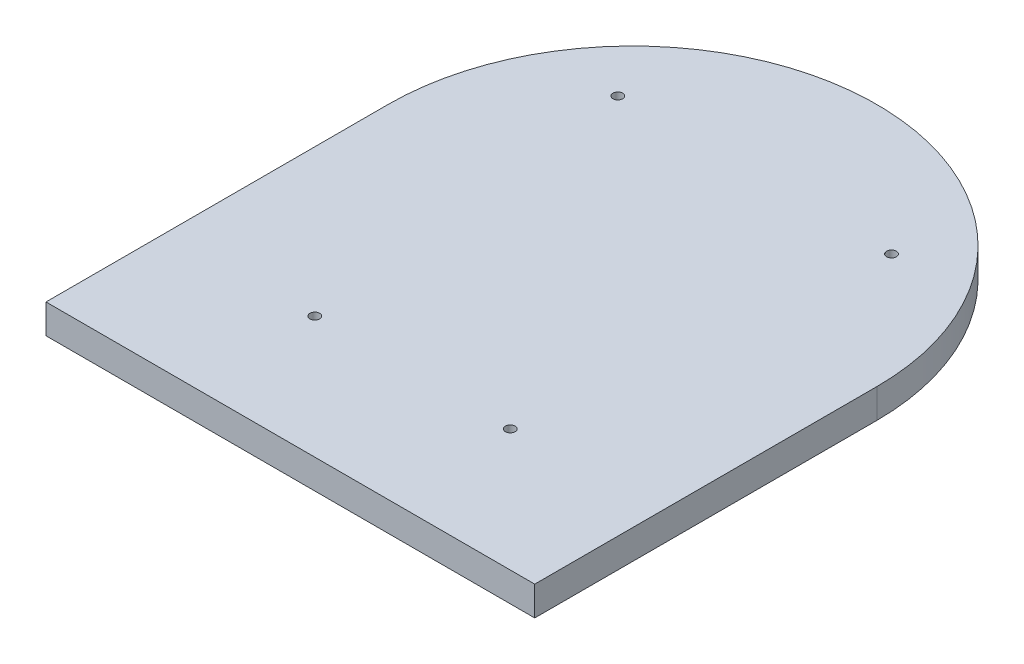
ISO-10303-21;
HEADER;
FILE_DESCRIPTION(('STEP AP214'),'2;1');
FILE_NAME('part.step','',(''),(''),'','','');
FILE_SCHEMA(('AUTOMOTIVE_DESIGN { 1 0 10303 214 1 1 1 1 }'));
ENDSEC;
DATA;
#1=APPLICATION_CONTEXT('core data for automotive mechanical design processes');
#2=APPLICATION_PROTOCOL_DEFINITION('international standard','automotive_design',2000,#1);
#3=PRODUCT_CONTEXT('',#1,'mechanical');
#4=PRODUCT('Part','Part','',(#3));
#5=PRODUCT_RELATED_PRODUCT_CATEGORY('part','',(#4));
#6=PRODUCT_DEFINITION_FORMATION('','',#4);
#7=PRODUCT_DEFINITION_CONTEXT('part definition',#1,'design');
#8=PRODUCT_DEFINITION('design','',#6,#7);
#9=PRODUCT_DEFINITION_SHAPE('','',#8);
#10=(LENGTH_UNIT() NAMED_UNIT(*) SI_UNIT(.MILLI.,.METRE.));
#11=(NAMED_UNIT(*) PLANE_ANGLE_UNIT() SI_UNIT($,.RADIAN.));
#12=(NAMED_UNIT(*) SI_UNIT($,.STERADIAN.) SOLID_ANGLE_UNIT());
#13=UNCERTAINTY_MEASURE_WITH_UNIT(LENGTH_MEASURE(1.E-05),#10,'distance_accuracy_value','');
#14=(GEOMETRIC_REPRESENTATION_CONTEXT(3) GLOBAL_UNCERTAINTY_ASSIGNED_CONTEXT((#13)) GLOBAL_UNIT_ASSIGNED_CONTEXT((#10,
#11,#12)) REPRESENTATION_CONTEXT('',''));
#15=CARTESIAN_POINT('',(0.,0.,0.));
#16=DIRECTION('',(0.,0.,1.));
#17=DIRECTION('',(1.,0.,0.));
#18=AXIS2_PLACEMENT_3D('',#15,#16,#17);
#19=CARTESIAN_POINT('',(50.,6.,-70.));
#20=DIRECTION('',(0.,-1.,0.));
#21=DIRECTION('',(0.,0.,-1.));
#22=AXIS2_PLACEMENT_3D('',#19,#20,#21);
#23=PLANE('',#22);
#24=DIRECTION('',(0.,0.,1.));
#25=VECTOR('',#24,1.);
#26=CARTESIAN_POINT('',(0.,6.,0.));
#27=LINE('',#26,#25);
#28=CARTESIAN_POINT('',(0.,6.,-70.));
#29=VERTEX_POINT('',#28);
#30=CARTESIAN_POINT('',(0.,6.,0.));
#31=VERTEX_POINT('',#30);
#32=EDGE_CURVE('E92',#29,#31,#27,.T.);
#33=ORIENTED_EDGE('',*,*,#32,.T.);
#34=DIRECTION('',(1.,0.,0.));
#35=VECTOR('',#34,1.);
#36=CARTESIAN_POINT('',(0.,6.,0.));
#37=LINE('',#36,#35);
#38=CARTESIAN_POINT('',(100.,6.,0.));
#39=VERTEX_POINT('',#38);
#40=EDGE_CURVE('E87',#31,#39,#37,.T.);
#41=ORIENTED_EDGE('',*,*,#40,.T.);
#42=DIRECTION('',(0.,0.,-1.));
#43=VECTOR('',#42,1.);
#44=CARTESIAN_POINT('',(100.,6.,0.));
#45=LINE('',#44,#43);
#46=CARTESIAN_POINT('',(100.,6.,-70.));
#47=VERTEX_POINT('',#46);
#48=EDGE_CURVE('E90',#39,#47,#45,.T.);
#49=ORIENTED_EDGE('',*,*,#48,.T.);
#50=CARTESIAN_POINT('',(50.,6.,-70.));
#51=DIRECTION('',(0.,1.,0.));
#52=DIRECTION('',(0.,0.,-1.));
#53=AXIS2_PLACEMENT_3D('',#50,#51,#52);
#54=CIRCLE('',#53,50.);
#55=EDGE_CURVE('E57',#47,#29,#54,.T.);
#56=ORIENTED_EDGE('',*,*,#55,.T.);
#57=EDGE_LOOP('',(#33,#41,#49,#56));
#58=FACE_BOUND('',#57,.T.);
#59=CARTESIAN_POINT('',(22.,6.,-95.));
#60=DIRECTION('',(0.,1.,0.));
#61=DIRECTION('',(0.,0.,1.));
#62=AXIS2_PLACEMENT_3D('',#59,#60,#61);
#63=CIRCLE('',#62,1.);
#64=CARTESIAN_POINT('',(22.,6.,-94.));
#65=VERTEX_POINT('',#64);
#66=EDGE_CURVE('E112',#65,#65,#63,.T.);
#67=ORIENTED_EDGE('',*,*,#66,.F.);
#68=EDGE_LOOP('',(#67));
#69=FACE_BOUND('',#68,.T.);
#70=CARTESIAN_POINT('',(78.,6.,-95.));
#71=DIRECTION('',(0.,1.,0.));
#72=DIRECTION('',(0.,0.,1.));
#73=AXIS2_PLACEMENT_3D('',#70,#71,#72);
#74=CIRCLE('',#73,0.999999999999998);
#75=CARTESIAN_POINT('',(78.,6.,-94.));
#76=VERTEX_POINT('',#75);
#77=EDGE_CURVE('E134',#76,#76,#74,.T.);
#78=ORIENTED_EDGE('',*,*,#77,.F.);
#79=EDGE_LOOP('',(#78));
#80=FACE_BOUND('',#79,.T.);
#81=CARTESIAN_POINT('',(30.,6.,-25.));
#82=DIRECTION('',(0.,1.,0.));
#83=DIRECTION('',(0.,0.,1.));
#84=AXIS2_PLACEMENT_3D('',#81,#82,#83);
#85=CIRCLE('',#84,1.);
#86=CARTESIAN_POINT('',(30.,6.,-24.));
#87=VERTEX_POINT('',#86);
#88=EDGE_CURVE('E142',#87,#87,#85,.T.);
#89=ORIENTED_EDGE('',*,*,#88,.F.);
#90=EDGE_LOOP('',(#89));
#91=FACE_BOUND('',#90,.T.);
#92=CARTESIAN_POINT('',(70.,6.,-25.));
#93=DIRECTION('',(0.,1.,0.));
#94=DIRECTION('',(0.,0.,1.));
#95=AXIS2_PLACEMENT_3D('',#92,#93,#94);
#96=CIRCLE('',#95,0.999999999999998);
#97=CARTESIAN_POINT('',(70.,6.,-24.));
#98=VERTEX_POINT('',#97);
#99=EDGE_CURVE('E150',#98,#98,#96,.T.);
#100=ORIENTED_EDGE('',*,*,#99,.F.);
#101=EDGE_LOOP('',(#100));
#102=FACE_BOUND('',#101,.T.);
#103=ADVANCED_FACE('F39',(#58,#69,#80,#91,#102),#23,.F.);
#104=CARTESIAN_POINT('',(50.,0.,-70.));
#105=DIRECTION('',(0.,-1.,0.));
#106=DIRECTION('',(0.,0.,-1.));
#107=AXIS2_PLACEMENT_3D('',#104,#105,#106);
#108=PLANE('',#107);
#109=CARTESIAN_POINT('',(30.,0.,-25.));
#110=DIRECTION('',(0.,1.,0.));
#111=DIRECTION('',(0.,0.,1.));
#112=AXIS2_PLACEMENT_3D('',#109,#110,#111);
#113=CIRCLE('',#112,1.);
#114=CARTESIAN_POINT('',(30.,0.,-24.));
#115=VERTEX_POINT('',#114);
#116=EDGE_CURVE('E146',#115,#115,#113,.T.);
#117=ORIENTED_EDGE('',*,*,#116,.T.);
#118=EDGE_LOOP('',(#117));
#119=FACE_BOUND('',#118,.T.);
#120=CARTESIAN_POINT('',(22.,0.,-95.));
#121=DIRECTION('',(0.,1.,0.));
#122=DIRECTION('',(0.,0.,1.));
#123=AXIS2_PLACEMENT_3D('',#120,#121,#122);
#124=CIRCLE('',#123,1.);
#125=CARTESIAN_POINT('',(22.,0.,-94.));
#126=VERTEX_POINT('',#125);
#127=EDGE_CURVE('E130',#126,#126,#124,.T.);
#128=ORIENTED_EDGE('',*,*,#127,.T.);
#129=EDGE_LOOP('',(#128));
#130=FACE_BOUND('',#129,.T.);
#131=DIRECTION('',(0.,0.,1.));
#132=VECTOR('',#131,1.);
#133=CARTESIAN_POINT('',(0.,0.,0.));
#134=LINE('',#133,#132);
#135=CARTESIAN_POINT('',(0.,0.,-70.));
#136=VERTEX_POINT('',#135);
#137=CARTESIAN_POINT('',(0.,0.,0.));
#138=VERTEX_POINT('',#137);
#139=EDGE_CURVE('E108',#136,#138,#134,.T.);
#140=ORIENTED_EDGE('',*,*,#139,.F.);
#141=CARTESIAN_POINT('',(50.,0.,-70.));
#142=DIRECTION('',(0.,1.,0.));
#143=DIRECTION('',(0.,0.,-1.));
#144=AXIS2_PLACEMENT_3D('',#141,#142,#143);
#145=CIRCLE('',#144,50.);
#146=CARTESIAN_POINT('',(100.,0.,-70.));
#147=VERTEX_POINT('',#146);
#148=EDGE_CURVE('E80',#147,#136,#145,.T.);
#149=ORIENTED_EDGE('',*,*,#148,.F.);
#150=DIRECTION('',(0.,0.,-1.));
#151=VECTOR('',#150,1.);
#152=CARTESIAN_POINT('',(100.,0.,0.));
#153=LINE('',#152,#151);
#154=CARTESIAN_POINT('',(100.,0.,0.));
#155=VERTEX_POINT('',#154);
#156=EDGE_CURVE('E74',#155,#147,#153,.T.);
#157=ORIENTED_EDGE('',*,*,#156,.F.);
#158=DIRECTION('',(1.,0.,0.));
#159=VECTOR('',#158,1.);
#160=CARTESIAN_POINT('',(0.,0.,0.));
#161=LINE('',#160,#159);
#162=EDGE_CURVE('E97',#138,#155,#161,.T.);
#163=ORIENTED_EDGE('',*,*,#162,.F.);
#164=EDGE_LOOP('',(#140,#149,#157,#163));
#165=FACE_BOUND('',#164,.T.);
#166=CARTESIAN_POINT('',(78.,0.,-95.));
#167=DIRECTION('',(0.,1.,0.));
#168=DIRECTION('',(0.,0.,1.));
#169=AXIS2_PLACEMENT_3D('',#166,#167,#168);
#170=CIRCLE('',#169,0.999999999999998);
#171=CARTESIAN_POINT('',(78.,0.,-94.));
#172=VERTEX_POINT('',#171);
#173=EDGE_CURVE('E138',#172,#172,#170,.T.);
#174=ORIENTED_EDGE('',*,*,#173,.T.);
#175=EDGE_LOOP('',(#174));
#176=FACE_BOUND('',#175,.T.);
#177=CARTESIAN_POINT('',(70.,0.,-25.));
#178=DIRECTION('',(0.,1.,0.));
#179=DIRECTION('',(0.,0.,1.));
#180=AXIS2_PLACEMENT_3D('',#177,#178,#179);
#181=CIRCLE('',#180,0.999999999999998);
#182=CARTESIAN_POINT('',(70.,0.,-24.));
#183=VERTEX_POINT('',#182);
#184=EDGE_CURVE('E154',#183,#183,#181,.T.);
#185=ORIENTED_EDGE('',*,*,#184,.T.);
#186=EDGE_LOOP('',(#185));
#187=FACE_BOUND('',#186,.T.);
#188=ADVANCED_FACE('F125',(#119,#130,#165,#176,#187),#108,.T.);
#189=CARTESIAN_POINT('',(0.,6.,0.));
#190=DIRECTION('',(1.,0.,0.));
#191=DIRECTION('',(0.,0.,-1.));
#192=AXIS2_PLACEMENT_3D('',#189,#190,#191);
#193=PLANE('',#192);
#194=ORIENTED_EDGE('',*,*,#139,.T.);
#195=DIRECTION('',(0.,-1.,0.));
#196=VECTOR('',#195,1.);
#197=CARTESIAN_POINT('',(0.,6.,0.));
#198=LINE('',#197,#196);
#199=EDGE_CURVE('E11',#31,#138,#198,.T.);
#200=ORIENTED_EDGE('',*,*,#199,.F.);
#201=ORIENTED_EDGE('',*,*,#32,.F.);
#202=DIRECTION('',(0.,-1.,0.));
#203=VECTOR('',#202,1.);
#204=CARTESIAN_POINT('',(0.,6.,-70.));
#205=LINE('',#204,#203);
#206=EDGE_CURVE('E104',#29,#136,#205,.T.);
#207=ORIENTED_EDGE('',*,*,#206,.T.);
#208=EDGE_LOOP('',(#194,#200,#201,#207));
#209=FACE_BOUND('',#208,.T.);
#210=ADVANCED_FACE('F41',(#209),#193,.F.);
#211=CARTESIAN_POINT('',(0.,6.,0.));
#212=DIRECTION('',(0.,0.,-1.));
#213=DIRECTION('',(-1.,0.,0.));
#214=AXIS2_PLACEMENT_3D('',#211,#212,#213);
#215=PLANE('',#214);
#216=ORIENTED_EDGE('',*,*,#162,.T.);
#217=DIRECTION('',(0.,-1.,0.));
#218=VECTOR('',#217,1.);
#219=CARTESIAN_POINT('',(100.,6.,0.));
#220=LINE('',#219,#218);
#221=EDGE_CURVE('E49',#39,#155,#220,.T.);
#222=ORIENTED_EDGE('',*,*,#221,.F.);
#223=ORIENTED_EDGE('',*,*,#40,.F.);
#224=ORIENTED_EDGE('',*,*,#199,.T.);
#225=EDGE_LOOP('',(#216,#222,#223,#224));
#226=FACE_BOUND('',#225,.T.);
#227=ADVANCED_FACE('F96',(#226),#215,.F.);
#228=CARTESIAN_POINT('',(100.,6.,0.));
#229=DIRECTION('',(-1.,0.,0.));
#230=DIRECTION('',(0.,0.,1.));
#231=AXIS2_PLACEMENT_3D('',#228,#229,#230);
#232=PLANE('',#231);
#233=ORIENTED_EDGE('',*,*,#156,.T.);
#234=DIRECTION('',(0.,-1.,0.));
#235=VECTOR('',#234,1.);
#236=CARTESIAN_POINT('',(100.,6.,-70.));
#237=LINE('',#236,#235);
#238=EDGE_CURVE('E99',#47,#147,#237,.T.);
#239=ORIENTED_EDGE('',*,*,#238,.F.);
#240=ORIENTED_EDGE('',*,*,#48,.F.);
#241=ORIENTED_EDGE('',*,*,#221,.T.);
#242=EDGE_LOOP('',(#233,#239,#240,#241));
#243=FACE_BOUND('',#242,.T.);
#244=ADVANCED_FACE('F100',(#243),#232,.F.);
#245=CARTESIAN_POINT('',(50.,6.,-70.));
#246=DIRECTION('',(0.,-1.,0.));
#247=DIRECTION('',(0.,0.,-1.));
#248=AXIS2_PLACEMENT_3D('',#245,#246,#247);
#249=CYLINDRICAL_SURFACE('',#248,50.);
#250=ORIENTED_EDGE('',*,*,#148,.T.);
#251=ORIENTED_EDGE('',*,*,#206,.F.);
#252=ORIENTED_EDGE('',*,*,#55,.F.);
#253=ORIENTED_EDGE('',*,*,#238,.T.);
#254=EDGE_LOOP('',(#250,#251,#252,#253));
#255=FACE_BOUND('',#254,.T.);
#256=ADVANCED_FACE('F122',(#255),#249,.T.);
#257=CARTESIAN_POINT('',(22.,6.,-95.));
#258=DIRECTION('',(0.,-1.,0.));
#259=DIRECTION('',(0.,0.,-1.));
#260=AXIS2_PLACEMENT_3D('',#257,#258,#259);
#261=CYLINDRICAL_SURFACE('',#260,1.);
#262=ORIENTED_EDGE('',*,*,#66,.T.);
#263=EDGE_LOOP('',(#262));
#264=FACE_BOUND('',#263,.T.);
#265=ORIENTED_EDGE('',*,*,#127,.F.);
#266=EDGE_LOOP('',(#265));
#267=FACE_BOUND('',#266,.T.);
#268=ADVANCED_FACE('F173',(#264,#267),#261,.F.);
#269=CARTESIAN_POINT('',(78.,6.,-95.));
#270=DIRECTION('',(0.,-1.,0.));
#271=DIRECTION('',(0.,0.,-1.));
#272=AXIS2_PLACEMENT_3D('',#269,#270,#271);
#273=CYLINDRICAL_SURFACE('',#272,0.999999999999998);
#274=ORIENTED_EDGE('',*,*,#77,.T.);
#275=EDGE_LOOP('',(#274));
#276=FACE_BOUND('',#275,.T.);
#277=ORIENTED_EDGE('',*,*,#173,.F.);
#278=EDGE_LOOP('',(#277));
#279=FACE_BOUND('',#278,.T.);
#280=ADVANCED_FACE('F219',(#276,#279),#273,.F.);
#281=CARTESIAN_POINT('',(30.,6.,-25.));
#282=DIRECTION('',(0.,-1.,0.));
#283=DIRECTION('',(0.,0.,-1.));
#284=AXIS2_PLACEMENT_3D('',#281,#282,#283);
#285=CYLINDRICAL_SURFACE('',#284,1.);
#286=ORIENTED_EDGE('',*,*,#88,.T.);
#287=EDGE_LOOP('',(#286));
#288=FACE_BOUND('',#287,.T.);
#289=ORIENTED_EDGE('',*,*,#116,.F.);
#290=EDGE_LOOP('',(#289));
#291=FACE_BOUND('',#290,.T.);
#292=ADVANCED_FACE('F227',(#288,#291),#285,.F.);
#293=CARTESIAN_POINT('',(70.,6.,-25.));
#294=DIRECTION('',(0.,-1.,0.));
#295=DIRECTION('',(0.,0.,-1.));
#296=AXIS2_PLACEMENT_3D('',#293,#294,#295);
#297=CYLINDRICAL_SURFACE('',#296,0.999999999999998);
#298=ORIENTED_EDGE('',*,*,#99,.T.);
#299=EDGE_LOOP('',(#298));
#300=FACE_BOUND('',#299,.T.);
#301=ORIENTED_EDGE('',*,*,#184,.F.);
#302=EDGE_LOOP('',(#301));
#303=FACE_BOUND('',#302,.T.);
#304=ADVANCED_FACE('F162',(#300,#303),#297,.F.);
#305=CLOSED_SHELL('',(#103,#188,#210,#227,#244,#256,#268,#280,#292,#304));
#306=MANIFOLD_SOLID_BREP('B2',#305);
#307=ADVANCED_BREP_SHAPE_REPRESENTATION('',(#18,#306),#14);
#308=SHAPE_DEFINITION_REPRESENTATION(#9,#307);
ENDSEC;
END-ISO-10303-21;
